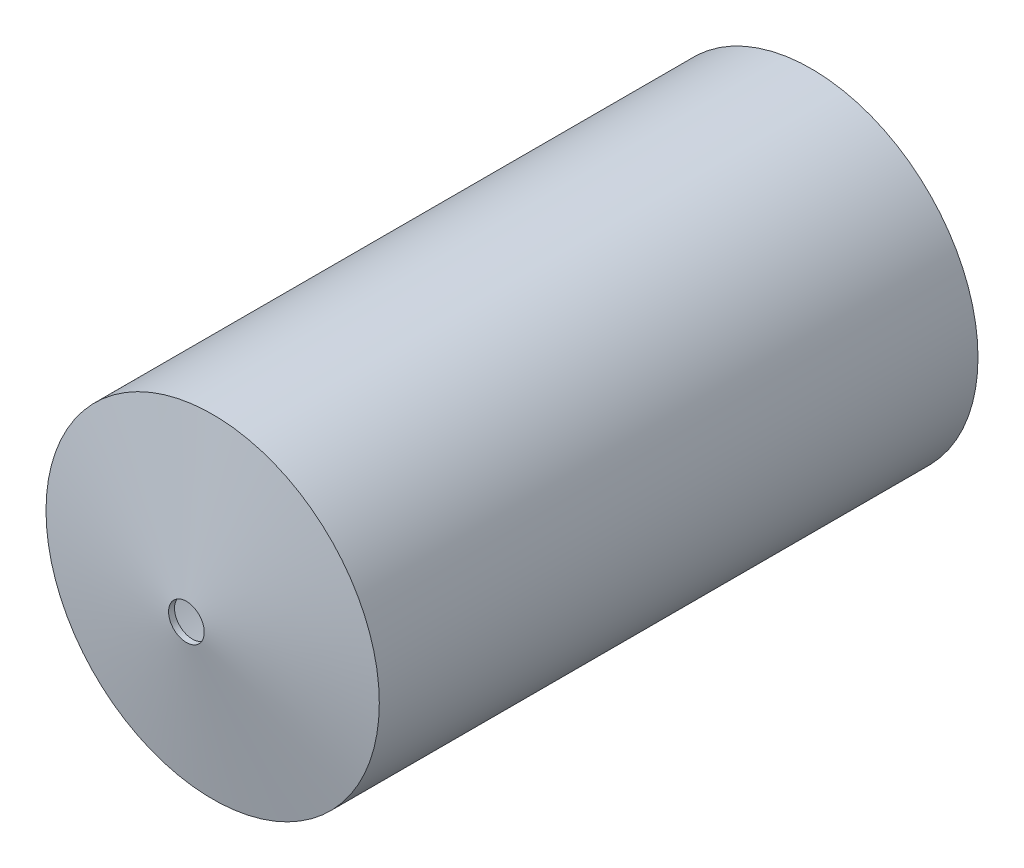
ISO-10303-21;
HEADER;
FILE_DESCRIPTION(('STEP AP214'),'2;1');
FILE_NAME('part.step','',(''),(''),'','','');
FILE_SCHEMA(('AUTOMOTIVE_DESIGN { 1 0 10303 214 1 1 1 1 }'));
ENDSEC;
DATA;
#1=APPLICATION_CONTEXT('core data for automotive mechanical design processes');
#2=APPLICATION_PROTOCOL_DEFINITION('international standard','automotive_design',2000,#1);
#3=PRODUCT_CONTEXT('',#1,'mechanical');
#4=PRODUCT('Part','Part','',(#3));
#5=PRODUCT_RELATED_PRODUCT_CATEGORY('part','',(#4));
#6=PRODUCT_DEFINITION_FORMATION('','',#4);
#7=PRODUCT_DEFINITION_CONTEXT('part definition',#1,'design');
#8=PRODUCT_DEFINITION('design','',#6,#7);
#9=PRODUCT_DEFINITION_SHAPE('','',#8);
#10=(LENGTH_UNIT() NAMED_UNIT(*) SI_UNIT(.MILLI.,.METRE.));
#11=(NAMED_UNIT(*) PLANE_ANGLE_UNIT() SI_UNIT($,.RADIAN.));
#12=(NAMED_UNIT(*) SI_UNIT($,.STERADIAN.) SOLID_ANGLE_UNIT());
#13=UNCERTAINTY_MEASURE_WITH_UNIT(LENGTH_MEASURE(1.E-05),#10,'distance_accuracy_value','');
#14=(GEOMETRIC_REPRESENTATION_CONTEXT(3) GLOBAL_UNCERTAINTY_ASSIGNED_CONTEXT((#13)) GLOBAL_UNIT_ASSIGNED_CONTEXT((#10,
#11,#12)) REPRESENTATION_CONTEXT('',''));
#15=CARTESIAN_POINT('',(0.,0.,0.));
#16=DIRECTION('',(0.,0.,1.));
#17=DIRECTION('',(1.,0.,0.));
#18=AXIS2_PLACEMENT_3D('',#15,#16,#17);
#19=CARTESIAN_POINT('',(0.,0.,0.));
#20=DIRECTION('',(0.,0.,1.));
#21=DIRECTION('',(1.,0.,0.));
#22=AXIS2_PLACEMENT_3D('',#19,#20,#21);
#23=CYLINDRICAL_SURFACE('',#22,3.81);
#24=CARTESIAN_POINT('',(0.,0.,0.));
#25=DIRECTION('',(0.,0.,1.));
#26=DIRECTION('',(1.,0.,0.));
#27=AXIS2_PLACEMENT_3D('',#24,#25,#26);
#28=CIRCLE('',#27,3.81);
#29=CARTESIAN_POINT('',(-3.81,0.,0.));
#30=VERTEX_POINT('',#29);
#31=EDGE_CURVE('E10',#30,#30,#28,.T.);
#32=ORIENTED_EDGE('',*,*,#31,.T.);
#33=EDGE_LOOP('',(#32));
#34=FACE_BOUND('',#33,.T.);
#35=CARTESIAN_POINT('',(0.,0.,-1.27));
#36=DIRECTION('',(0.,0.,1.));
#37=DIRECTION('',(1.,0.,0.));
#38=AXIS2_PLACEMENT_3D('',#35,#36,#37);
#39=CIRCLE('',#38,3.81);
#40=CARTESIAN_POINT('',(-3.80999999999999,0.,-1.27));
#41=VERTEX_POINT('',#40);
#42=EDGE_CURVE('E64',#41,#41,#39,.T.);
#43=ORIENTED_EDGE('',*,*,#42,.F.);
#44=EDGE_LOOP('',(#43));
#45=FACE_BOUND('',#44,.T.);
#46=ADVANCED_FACE('F37',(#34,#45),#23,.F.);
#47=CARTESIAN_POINT('',(0.,0.,0.));
#48=DIRECTION('',(0.,0.,-1.));
#49=DIRECTION('',(-1.,0.,0.));
#50=AXIS2_PLACEMENT_3D('',#47,#48,#49);
#51=CONICAL_SURFACE('',#50,3.81,1.39626340159547);
#52=CARTESIAN_POINT('',(0.,0.,-5.59838163749354));
#53=DIRECTION('',(0.,0.,1.));
#54=DIRECTION('',(1.,0.,0.));
#55=AXIS2_PLACEMENT_3D('',#52,#53,#54);
#56=CIRCLE('',#55,35.56);
#57=CARTESIAN_POINT('',(-35.56,0.,-5.59838163749354));
#58=VERTEX_POINT('',#57);
#59=EDGE_CURVE('E44',#58,#58,#56,.T.);
#60=CARTESIAN_POINT('',(-35.56,0.,-5.59838163749354));
#61=CARTESIAN_POINT('',(-35.2292708333333,0.,-5.54006516210299));
#62=CARTESIAN_POINT('',(-34.8985416666666,0.,-5.48174868671243));
#63=CARTESIAN_POINT('',(-34.2370833333333,0.,-5.36511573593131));
#64=CARTESIAN_POINT('',(-33.9063541666666,0.,-5.30679926054076));
#65=CARTESIAN_POINT('',(-33.2448958333333,0.,-5.19016630975964));
#66=CARTESIAN_POINT('',(-32.9141666666666,0.,-5.13184983436908));
#67=CARTESIAN_POINT('',(-32.2527083333333,0.,-5.01521688358797));
#68=CARTESIAN_POINT('',(-31.9219791666666,0.,-4.95690040819741));
#69=CARTESIAN_POINT('',(-31.2605208333333,0.,-4.84026745741629));
#70=CARTESIAN_POINT('',(-30.9297916666666,0.,-4.78195098202574));
#71=CARTESIAN_POINT('',(-30.2683333333333,0.,-4.66531803124462));
#72=CARTESIAN_POINT('',(-29.9376041666666,0.,-4.60700155585406));
#73=CARTESIAN_POINT('',(-29.2761458333333,0.,-4.49036860507295));
#74=CARTESIAN_POINT('',(-28.9454166666666,0.,-4.43205212968239));
#75=CARTESIAN_POINT('',(-28.2839583333333,0.,-4.31541917890127));
#76=CARTESIAN_POINT('',(-27.9532291666666,0.,-4.25710270351072));
#77=CARTESIAN_POINT('',(-27.2917708333333,0.,-4.1404697527296));
#78=CARTESIAN_POINT('',(-26.9610416666666,0.,-4.08215327733904));
#79=CARTESIAN_POINT('',(-26.2995833333333,0.,-3.96552032655793));
#80=CARTESIAN_POINT('',(-25.9688541666667,0.,-3.90720385116737));
#81=CARTESIAN_POINT('',(-25.3073958333333,0.,-3.79057090038625));
#82=CARTESIAN_POINT('',(-24.9766666666667,0.,-3.7322544249957));
#83=CARTESIAN_POINT('',(-24.3152083333333,0.,-3.61562147421458));
#84=CARTESIAN_POINT('',(-23.9844791666667,0.,-3.55730499882402));
#85=CARTESIAN_POINT('',(-23.3230208333333,0.,-3.44067204804291));
#86=CARTESIAN_POINT('',(-22.9922916666667,0.,-3.38235557265235));
#87=CARTESIAN_POINT('',(-22.3308333333333,0.,-3.26572262187123));
#88=CARTESIAN_POINT('',(-22.0001041666667,0.,-3.20740614648068));
#89=CARTESIAN_POINT('',(-21.3386458333333,0.,-3.09077319569956));
#90=CARTESIAN_POINT('',(-21.0079166666667,0.,-3.032456720309));
#91=CARTESIAN_POINT('',(-20.3464583333333,0.,-2.91582376952789));
#92=CARTESIAN_POINT('',(-20.0157291666667,0.,-2.85750729413733));
#93=CARTESIAN_POINT('',(-19.3542708333333,0.,-2.74087434335621));
#94=CARTESIAN_POINT('',(-19.0235416666667,0.,-2.68255786796566));
#95=CARTESIAN_POINT('',(-18.3620833333333,0.,-2.56592491718454));
#96=CARTESIAN_POINT('',(-18.0313541666667,0.,-2.50760844179398));
#97=CARTESIAN_POINT('',(-17.3698958333333,0.,-2.39097549101287));
#98=CARTESIAN_POINT('',(-17.0391666666667,0.,-2.33265901562231));
#99=CARTESIAN_POINT('',(-16.3777083333333,0.,-2.21602606484119));
#100=CARTESIAN_POINT('',(-16.0469791666667,0.,-2.15770958945064));
#101=CARTESIAN_POINT('',(-15.3855208333333,0.,-2.04107663866952));
#102=CARTESIAN_POINT('',(-15.0547916666667,0.,-1.98276016327896));
#103=CARTESIAN_POINT('',(-14.3933333333333,0.,-1.86612721249785));
#104=CARTESIAN_POINT('',(-14.0626041666667,0.,-1.80781073710729));
#105=CARTESIAN_POINT('',(-13.4011458333333,0.,-1.69117778632617));
#106=CARTESIAN_POINT('',(-13.0704166666667,0.,-1.63286131093562));
#107=CARTESIAN_POINT('',(-12.4089583333333,0.,-1.5162283601545));
#108=CARTESIAN_POINT('',(-12.0782291666667,0.,-1.45791188476394));
#109=CARTESIAN_POINT('',(-11.4167708333333,0.,-1.34127893398283));
#110=CARTESIAN_POINT('',(-11.0860416666667,0.,-1.28296245859227));
#111=CARTESIAN_POINT('',(-10.4245833333333,0.,-1.16632950781116));
#112=CARTESIAN_POINT('',(-10.0938541666667,0.,-1.1080130324206));
#113=CARTESIAN_POINT('',(-9.43239583333333,0.,-0.991380081639482));
#114=CARTESIAN_POINT('',(-9.10166666666666,0.,-0.933063606248924));
#115=CARTESIAN_POINT('',(-8.44020833333333,0.,-0.816430655467809));
#116=CARTESIAN_POINT('',(-8.10947916666666,0.,-0.758114180077251));
#117=CARTESIAN_POINT('',(-7.44802083333333,0.,-0.641481229296135));
#118=CARTESIAN_POINT('',(-7.11729166666666,0.,-0.583164753905578));
#119=CARTESIAN_POINT('',(-6.45583333333333,0.,-0.466531803124462));
#120=CARTESIAN_POINT('',(-6.12510416666666,0.,-0.408215327733905));
#121=CARTESIAN_POINT('',(-5.46364583333333,0.,-0.291582376952789));
#122=CARTESIAN_POINT('',(-5.13291666666667,0.,-0.233265901562231));
#123=CARTESIAN_POINT('',(-4.47145833333333,0.,-0.116632950781116));
#124=CARTESIAN_POINT('',(-4.14072916666667,0.,-0.0583164753905581));
#125=CARTESIAN_POINT('',(-3.81,0.,0.));
#126=B_SPLINE_CURVE_WITH_KNOTS('',3,(#60,#61,#62,#63,#64,#65,#66,#67,#68,#69,#70,#71,#72,#73,
#74,#75,#76,#77,#78,#79,#80,#81,#82,#83,#84,#85,#86,#87,#88,#89,#90,#91,#92,#93,#94,#95,#96,#97,
#98,#99,#100,#101,#102,#103,#104,#105,#106,#107,#108,#109,#110,#111,#112,#113,#114,#115,#116,
#117,#118,#119,#120,#121,#122,#123,#124,#125),.UNSPECIFIED.,.F.,.F.,(4,2,2,2,2,2,2,2,2,2,2,2,2,
2,2,2,2,2,2,2,2,2,2,2,2,2,2,2,2,2,2,2,4),(0.,1.00749359148039,2.01498718296078,3.02248077444116,
4.02997436592155,5.03746795740193,6.04496154888232,7.0524551403627,8.05994873184309,
9.06744232332347,10.0749359148039,11.0824295062842,12.0899230977646,13.097416689245,
14.1049102807254,15.1124038722058,16.1198974636862,17.1273910551666,18.1348846466469,
19.1423782381273,20.1498718296077,21.1573654210881,22.1648590125685,23.1723526040489,
24.1798461955293,25.1873397870096,26.19483337849,27.2023269699704,28.2098205614508,
29.2173141529312,30.2248077444116,31.232301335892,32.2397949273723),.UNSPECIFIED.);
#127=EDGE_CURVE('BSEAM73',#58,#30,#126,.T.);
#128=ORIENTED_EDGE('',*,*,#59,.T.);
#129=ORIENTED_EDGE('',*,*,#31,.F.);
#130=ORIENTED_EDGE('',*,*,#127,.T.);
#131=ORIENTED_EDGE('',*,*,#127,.F.);
#132=EDGE_LOOP('',(#128,#130,#129,#131));
#133=FACE_BOUND('',#132,.T.);
#134=ADVANCED_FACE('F73',(#133),#51,.T.);
#135=CARTESIAN_POINT('',(0.,0.,0.));
#136=DIRECTION('',(0.,0.,1.));
#137=DIRECTION('',(1.,0.,0.));
#138=AXIS2_PLACEMENT_3D('',#135,#136,#137);
#139=CYLINDRICAL_SURFACE('',#138,35.56);
#140=CARTESIAN_POINT('',(0.,0.,-133.35));
#141=DIRECTION('',(0.,0.,1.));
#142=DIRECTION('',(1.,0.,0.));
#143=AXIS2_PLACEMENT_3D('',#140,#141,#142);
#144=CIRCLE('',#143,35.56);
#145=CARTESIAN_POINT('',(35.56,0.,-133.35));
#146=VERTEX_POINT('',#145);
#147=EDGE_CURVE('E49',#146,#146,#144,.T.);
#148=ORIENTED_EDGE('',*,*,#147,.T.);
#149=EDGE_LOOP('',(#148));
#150=FACE_BOUND('',#149,.T.);
#151=ORIENTED_EDGE('',*,*,#59,.F.);
#152=EDGE_LOOP('',(#151));
#153=FACE_BOUND('',#152,.T.);
#154=ADVANCED_FACE('F77',(#150,#153),#139,.T.);
#155=CARTESIAN_POINT('',(34.29,0.,-133.35));
#156=DIRECTION('',(0.,0.,-1.));
#157=DIRECTION('',(-1.,0.,0.));
#158=AXIS2_PLACEMENT_3D('',#155,#156,#157);
#159=PLANE('',#158);
#160=CARTESIAN_POINT('',(0.,0.,-133.35));
#161=DIRECTION('',(0.,0.,1.));
#162=DIRECTION('',(1.,0.,0.));
#163=AXIS2_PLACEMENT_3D('',#160,#161,#162);
#164=CIRCLE('',#163,34.29);
#165=CARTESIAN_POINT('',(34.29,0.,-133.35));
#166=VERTEX_POINT('',#165);
#167=EDGE_CURVE('E54',#166,#166,#164,.T.);
#168=ORIENTED_EDGE('',*,*,#167,.T.);
#169=EDGE_LOOP('',(#168));
#170=FACE_BOUND('',#169,.T.);
#171=ORIENTED_EDGE('',*,*,#147,.F.);
#172=EDGE_LOOP('',(#171));
#173=FACE_BOUND('',#172,.T.);
#174=ADVANCED_FACE('F81',(#170,#173),#159,.T.);
#175=CARTESIAN_POINT('',(0.,0.,0.));
#176=DIRECTION('',(0.,0.,1.));
#177=DIRECTION('',(1.,0.,0.));
#178=AXIS2_PLACEMENT_3D('',#175,#176,#177);
#179=CYLINDRICAL_SURFACE('',#178,34.29);
#180=CARTESIAN_POINT('',(0.,0.,-6.64444637199381));
#181=DIRECTION('',(0.,0.,1.));
#182=DIRECTION('',(1.,0.,0.));
#183=AXIS2_PLACEMENT_3D('',#180,#181,#182);
#184=CIRCLE('',#183,34.29);
#185=CARTESIAN_POINT('',(-34.29,0.,-6.64444637199381));
#186=VERTEX_POINT('',#185);
#187=EDGE_CURVE('E60',#186,#186,#184,.T.);
#188=ORIENTED_EDGE('',*,*,#187,.T.);
#189=EDGE_LOOP('',(#188));
#190=FACE_BOUND('',#189,.T.);
#191=ORIENTED_EDGE('',*,*,#167,.F.);
#192=EDGE_LOOP('',(#191));
#193=FACE_BOUND('',#192,.T.);
#194=ADVANCED_FACE('F88',(#190,#193),#179,.F.);
#195=CARTESIAN_POINT('',(0.,0.,-6.64444637199381));
#196=DIRECTION('',(0.,0.,-1.));
#197=DIRECTION('',(-1.,0.,0.));
#198=AXIS2_PLACEMENT_3D('',#195,#196,#197);
#199=CONICAL_SURFACE('',#198,34.29,1.39626340159547);
#200=CARTESIAN_POINT('',(-3.80999999999999,0.,-1.27));
#201=CARTESIAN_POINT('',(-4.12749999999999,0.,-1.32598381637494));
#202=CARTESIAN_POINT('',(-4.44499999999999,0.,-1.38196763274987));
#203=CARTESIAN_POINT('',(-5.07999999999999,0.,-1.49393526549974));
#204=CARTESIAN_POINT('',(-5.39749999999999,0.,-1.54991908187468));
#205=CARTESIAN_POINT('',(-6.03249999999999,0.,-1.66188671462455));
#206=CARTESIAN_POINT('',(-6.34999999999999,0.,-1.71787053099948));
#207=CARTESIAN_POINT('',(-6.98499999999999,0.,-1.82983816374936));
#208=CARTESIAN_POINT('',(-7.30249999999999,0.,-1.88582198012429));
#209=CARTESIAN_POINT('',(-7.93749999999999,0.,-1.99778961287416));
#210=CARTESIAN_POINT('',(-8.25499999999999,0.,-2.0537734292491));
#211=CARTESIAN_POINT('',(-8.88999999999999,0.,-2.16574106199897));
#212=CARTESIAN_POINT('',(-9.20749999999999,0.,-2.2217248783739));
#213=CARTESIAN_POINT('',(-9.84249999999999,0.,-2.33369251112378));
#214=CARTESIAN_POINT('',(-10.16,0.,-2.38967632749871));
#215=CARTESIAN_POINT('',(-10.795,0.,-2.50164396024858));
#216=CARTESIAN_POINT('',(-11.1125,0.,-2.55762777662352));
#217=CARTESIAN_POINT('',(-11.7475,0.,-2.66959540937339));
#218=CARTESIAN_POINT('',(-12.065,0.,-2.72557922574832));
#219=CARTESIAN_POINT('',(-12.7,0.,-2.83754685849819));
#220=CARTESIAN_POINT('',(-13.0175,0.,-2.89353067487313));
#221=CARTESIAN_POINT('',(-13.6525,0.,-3.005498307623));
#222=CARTESIAN_POINT('',(-13.97,0.,-3.06148212399794));
#223=CARTESIAN_POINT('',(-14.605,0.,-3.17344975674781));
#224=CARTESIAN_POINT('',(-14.9225,0.,-3.22943357312274));
#225=CARTESIAN_POINT('',(-15.5575,0.,-3.34140120587261));
#226=CARTESIAN_POINT('',(-15.875,0.,-3.39738502224755));
#227=CARTESIAN_POINT('',(-16.51,0.,-3.50935265499742));
#228=CARTESIAN_POINT('',(-16.8275,0.,-3.56533647137236));
#229=CARTESIAN_POINT('',(-17.4625,0.,-3.67730410412223));
#230=CARTESIAN_POINT('',(-17.78,0.,-3.73328792049716));
#231=CARTESIAN_POINT('',(-18.415,0.,-3.84525555324703));
#232=CARTESIAN_POINT('',(-18.7325,0.,-3.90123936962197));
#233=CARTESIAN_POINT('',(-19.3675,0.,-4.01320700237184));
#234=CARTESIAN_POINT('',(-19.685,0.,-4.06919081874678));
#235=CARTESIAN_POINT('',(-20.32,0.,-4.18115845149665));
#236=CARTESIAN_POINT('',(-20.6375,0.,-4.23714226787158));
#237=CARTESIAN_POINT('',(-21.2725,0.,-4.34910990062145));
#238=CARTESIAN_POINT('',(-21.59,0.,-4.40509371699639));
#239=CARTESIAN_POINT('',(-22.225,0.,-4.51706134974626));
#240=CARTESIAN_POINT('',(-22.5425,0.,-4.5730451661212));
#241=CARTESIAN_POINT('',(-23.1775,0.,-4.68501279887107));
#242=CARTESIAN_POINT('',(-23.495,0.,-4.740996615246));
#243=CARTESIAN_POINT('',(-24.13,0.,-4.85296424799587));
#244=CARTESIAN_POINT('',(-24.4475,0.,-4.90894806437081));
#245=CARTESIAN_POINT('',(-25.0825,0.,-5.02091569712068));
#246=CARTESIAN_POINT('',(-25.4,0.,-5.07689951349562));
#247=CARTESIAN_POINT('',(-26.035,0.,-5.18886714624549));
#248=CARTESIAN_POINT('',(-26.3525,0.,-5.24485096262042));
#249=CARTESIAN_POINT('',(-26.9875,0.,-5.35681859537029));
#250=CARTESIAN_POINT('',(-27.305,0.,-5.41280241174523));
#251=CARTESIAN_POINT('',(-27.94,0.,-5.5247700444951));
#252=CARTESIAN_POINT('',(-28.2575,0.,-5.58075386087004));
#253=CARTESIAN_POINT('',(-28.8925,0.,-5.69272149361991));
#254=CARTESIAN_POINT('',(-29.21,0.,-5.74870530999484));
#255=CARTESIAN_POINT('',(-29.845,0.,-5.86067294274471));
#256=CARTESIAN_POINT('',(-30.1625,0.,-5.91665675911965));
#257=CARTESIAN_POINT('',(-30.7975,0.,-6.02862439186952));
#258=CARTESIAN_POINT('',(-31.115,0.,-6.08460820824446));
#259=CARTESIAN_POINT('',(-31.75,0.,-6.19657584099433));
#260=CARTESIAN_POINT('',(-32.0675,0.,-6.25255965736926));
#261=CARTESIAN_POINT('',(-32.7025,0.,-6.36452729011913));
#262=CARTESIAN_POINT('',(-33.02,0.,-6.42051110649407));
#263=CARTESIAN_POINT('',(-33.655,0.,-6.53247873924394));
#264=CARTESIAN_POINT('',(-33.9725,0.,-6.58846255561888));
#265=CARTESIAN_POINT('',(-34.29,0.,-6.64444637199381));
#266=B_SPLINE_CURVE_WITH_KNOTS('',3,(#200,#201,#202,#203,#204,#205,#206,#207,#208,#209,#210,
#211,#212,#213,#214,#215,#216,#217,#218,#219,#220,#221,#222,#223,#224,#225,#226,#227,#228,#229,
#230,#231,#232,#233,#234,#235,#236,#237,#238,#239,#240,#241,#242,#243,#244,#245,#246,#247,#248,
#249,#250,#251,#252,#253,#254,#255,#256,#257,#258,#259,#260,#261,#262,#263,#264,#265),
.UNSPECIFIED.,.F.,.F.,(4,2,2,2,2,2,2,2,2,2,2,2,2,2,2,2,2,2,2,2,2,2,2,2,2,2,2,2,2,2,2,2,4),(0.,
0.967193847821169,1.93438769564235,2.90158154346352,3.86877539128468,4.83596923910586,
5.80316308692703,6.7703569347482,7.73755078256937,8.70474463039054,9.67193847821172,
10.6391323260329,11.6063261738541,12.5735200216752,13.5407138694964,14.5079077173176,
15.4751015651387,16.4422954129599,17.4094892607811,18.3766831086023,19.3438769564234,
20.3110708042446,21.2782646520658,22.2454584998869,23.2126523477081,24.1798461955293,
25.1470400433505,26.1142338911716,27.0814277389928,28.048621586814,29.0158154346351,
29.9830092824563,30.9502031302775),.UNSPECIFIED.);
#267=EDGE_CURVE('BSEAM69',#41,#186,#266,.T.);
#268=ORIENTED_EDGE('',*,*,#42,.T.);
#269=ORIENTED_EDGE('',*,*,#187,.F.);
#270=ORIENTED_EDGE('',*,*,#267,.T.);
#271=ORIENTED_EDGE('',*,*,#267,.F.);
#272=EDGE_LOOP('',(#268,#270,#269,#271));
#273=FACE_BOUND('',#272,.T.);
#274=ADVANCED_FACE('F69',(#273),#199,.F.);
#275=CLOSED_SHELL('',(#46,#134,#154,#174,#194,#274));
#276=MANIFOLD_SOLID_BREP('B2',#275);
#277=ADVANCED_BREP_SHAPE_REPRESENTATION('',(#18,#276),#14);
#278=SHAPE_DEFINITION_REPRESENTATION(#9,#277);
ENDSEC;
END-ISO-10303-21;
